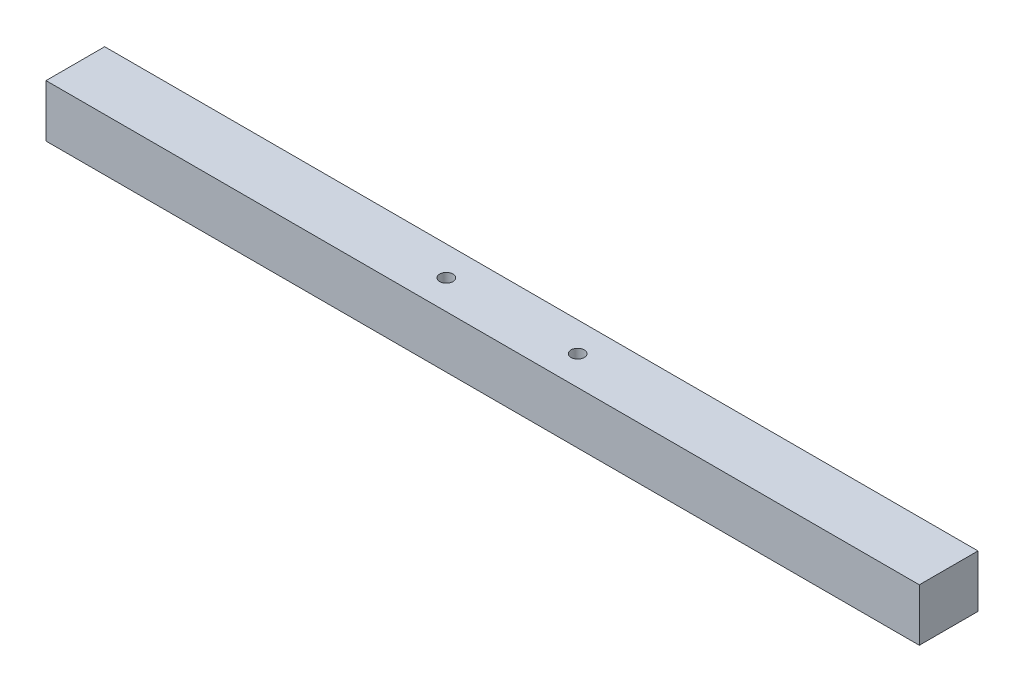
ISO-10303-21;
HEADER;
FILE_DESCRIPTION(('STEP AP214'),'2;1');
FILE_NAME('part.step','',(''),(''),'','','');
FILE_SCHEMA(('AUTOMOTIVE_DESIGN { 1 0 10303 214 1 1 1 1 }'));
ENDSEC;
DATA;
#1=APPLICATION_CONTEXT('core data for automotive mechanical design processes');
#2=APPLICATION_PROTOCOL_DEFINITION('international standard','automotive_design',2000,#1);
#3=PRODUCT_CONTEXT('',#1,'mechanical');
#4=PRODUCT('Part','Part','',(#3));
#5=PRODUCT_RELATED_PRODUCT_CATEGORY('part','',(#4));
#6=PRODUCT_DEFINITION_FORMATION('','',#4);
#7=PRODUCT_DEFINITION_CONTEXT('part definition',#1,'design');
#8=PRODUCT_DEFINITION('design','',#6,#7);
#9=PRODUCT_DEFINITION_SHAPE('','',#8);
#10=(LENGTH_UNIT() NAMED_UNIT(*) SI_UNIT(.MILLI.,.METRE.));
#11=(NAMED_UNIT(*) PLANE_ANGLE_UNIT() SI_UNIT($,.RADIAN.));
#12=(NAMED_UNIT(*) SI_UNIT($,.STERADIAN.) SOLID_ANGLE_UNIT());
#13=UNCERTAINTY_MEASURE_WITH_UNIT(LENGTH_MEASURE(1.E-05),#10,'distance_accuracy_value','');
#14=(GEOMETRIC_REPRESENTATION_CONTEXT(3) GLOBAL_UNCERTAINTY_ASSIGNED_CONTEXT((#13)) GLOBAL_UNIT_ASSIGNED_CONTEXT((#10,
#11,#12)) REPRESENTATION_CONTEXT('',''));
#15=CARTESIAN_POINT('',(0.,0.,0.));
#16=DIRECTION('',(0.,0.,1.));
#17=DIRECTION('',(1.,0.,0.));
#18=AXIS2_PLACEMENT_3D('',#15,#16,#17);
#19=CARTESIAN_POINT('',(0.,15.,0.));
#20=DIRECTION('',(0.,1.,0.));
#21=DIRECTION('',(0.,0.,1.));
#22=AXIS2_PLACEMENT_3D('',#19,#20,#21);
#23=PLANE('',#22);
#24=CARTESIAN_POINT('',(-18.8,15.,0.));
#25=DIRECTION('',(0.,1.,0.));
#26=DIRECTION('',(0.,0.,1.));
#27=AXIS2_PLACEMENT_3D('',#24,#25,#26);
#28=CIRCLE('',#27,1.9);
#29=CARTESIAN_POINT('',(-18.8,15.,1.9));
#30=VERTEX_POINT('',#29);
#31=EDGE_CURVE('E100',#30,#30,#28,.T.);
#32=ORIENTED_EDGE('',*,*,#31,.F.);
#33=EDGE_LOOP('',(#32));
#34=FACE_BOUND('',#33,.T.);
#35=DIRECTION('',(0.,0.,1.));
#36=VECTOR('',#35,1.);
#37=CARTESIAN_POINT('',(-125.,15.,8.40000000000002));
#38=LINE('',#37,#36);
#39=CARTESIAN_POINT('',(-125.,15.,-8.39999999999999));
#40=VERTEX_POINT('',#39);
#41=CARTESIAN_POINT('',(-125.,15.,8.40000000000002));
#42=VERTEX_POINT('',#41);
#43=EDGE_CURVE('E85',#40,#42,#38,.T.);
#44=ORIENTED_EDGE('',*,*,#43,.T.);
#45=DIRECTION('',(1.,0.,0.));
#46=VECTOR('',#45,1.);
#47=CARTESIAN_POINT('',(125.,15.,8.39999999999998));
#48=LINE('',#47,#46);
#49=CARTESIAN_POINT('',(125.,15.,8.39999999999998));
#50=VERTEX_POINT('',#49);
#51=EDGE_CURVE('E80',#42,#50,#48,.T.);
#52=ORIENTED_EDGE('',*,*,#51,.T.);
#53=DIRECTION('',(0.,0.,-1.));
#54=VECTOR('',#53,1.);
#55=CARTESIAN_POINT('',(125.,15.,8.39999999999998));
#56=LINE('',#55,#54);
#57=CARTESIAN_POINT('',(125.,15.,-8.40000000000002));
#58=VERTEX_POINT('',#57);
#59=EDGE_CURVE('E83',#50,#58,#56,.T.);
#60=ORIENTED_EDGE('',*,*,#59,.T.);
#61=DIRECTION('',(-1.,0.,0.));
#62=VECTOR('',#61,1.);
#63=CARTESIAN_POINT('',(125.,15.,-8.40000000000002));
#64=LINE('',#63,#62);
#65=EDGE_CURVE('E50',#58,#40,#64,.T.);
#66=ORIENTED_EDGE('',*,*,#65,.T.);
#67=EDGE_LOOP('',(#44,#52,#60,#66));
#68=FACE_BOUND('',#67,.T.);
#69=CARTESIAN_POINT('',(18.8,15.,0.));
#70=DIRECTION('',(0.,1.,0.));
#71=DIRECTION('',(0.,0.,1.));
#72=AXIS2_PLACEMENT_3D('',#69,#70,#71);
#73=CIRCLE('',#72,1.9);
#74=CARTESIAN_POINT('',(18.8,15.,1.9));
#75=VERTEX_POINT('',#74);
#76=EDGE_CURVE('E115',#75,#75,#73,.T.);
#77=ORIENTED_EDGE('',*,*,#76,.F.);
#78=EDGE_LOOP('',(#77));
#79=FACE_BOUND('',#78,.T.);
#80=ADVANCED_FACE('F33',(#34,#68,#79),#23,.T.);
#81=CARTESIAN_POINT('',(0.,0.,0.));
#82=DIRECTION('',(0.,1.,0.));
#83=DIRECTION('',(0.,0.,1.));
#84=AXIS2_PLACEMENT_3D('',#81,#82,#83);
#85=PLANE('',#84);
#86=CARTESIAN_POINT('',(-18.8,0.,0.));
#87=DIRECTION('',(0.,1.,0.));
#88=DIRECTION('',(0.,0.,1.));
#89=AXIS2_PLACEMENT_3D('',#86,#87,#88);
#90=CIRCLE('',#89,1.9);
#91=CARTESIAN_POINT('',(-18.8,0.,1.9));
#92=VERTEX_POINT('',#91);
#93=EDGE_CURVE('E112',#92,#92,#90,.T.);
#94=ORIENTED_EDGE('',*,*,#93,.T.);
#95=EDGE_LOOP('',(#94));
#96=FACE_BOUND('',#95,.T.);
#97=DIRECTION('',(0.,0.,1.));
#98=VECTOR('',#97,1.);
#99=CARTESIAN_POINT('',(-125.,0.,8.40000000000002));
#100=LINE('',#99,#98);
#101=CARTESIAN_POINT('',(-125.,0.,-8.39999999999999));
#102=VERTEX_POINT('',#101);
#103=CARTESIAN_POINT('',(-125.,0.,8.40000000000002));
#104=VERTEX_POINT('',#103);
#105=EDGE_CURVE('E97',#102,#104,#100,.T.);
#106=ORIENTED_EDGE('',*,*,#105,.F.);
#107=DIRECTION('',(-1.,0.,0.));
#108=VECTOR('',#107,1.);
#109=CARTESIAN_POINT('',(125.,0.,-8.40000000000002));
#110=LINE('',#109,#108);
#111=CARTESIAN_POINT('',(125.,0.,-8.40000000000002));
#112=VERTEX_POINT('',#111);
#113=EDGE_CURVE('E73',#112,#102,#110,.T.);
#114=ORIENTED_EDGE('',*,*,#113,.F.);
#115=DIRECTION('',(0.,0.,-1.));
#116=VECTOR('',#115,1.);
#117=CARTESIAN_POINT('',(125.,0.,8.39999999999998));
#118=LINE('',#117,#116);
#119=CARTESIAN_POINT('',(125.,0.,8.39999999999998));
#120=VERTEX_POINT('',#119);
#121=EDGE_CURVE('E67',#120,#112,#118,.T.);
#122=ORIENTED_EDGE('',*,*,#121,.F.);
#123=DIRECTION('',(1.,0.,0.));
#124=VECTOR('',#123,1.);
#125=CARTESIAN_POINT('',(125.,0.,8.39999999999998));
#126=LINE('',#125,#124);
#127=EDGE_CURVE('E89',#104,#120,#126,.T.);
#128=ORIENTED_EDGE('',*,*,#127,.F.);
#129=EDGE_LOOP('',(#106,#114,#122,#128));
#130=FACE_BOUND('',#129,.T.);
#131=CARTESIAN_POINT('',(18.8,0.,0.));
#132=DIRECTION('',(0.,1.,0.));
#133=DIRECTION('',(0.,0.,1.));
#134=AXIS2_PLACEMENT_3D('',#131,#132,#133);
#135=CIRCLE('',#134,1.9);
#136=CARTESIAN_POINT('',(18.8,0.,1.9));
#137=VERTEX_POINT('',#136);
#138=EDGE_CURVE('E118',#137,#137,#135,.T.);
#139=ORIENTED_EDGE('',*,*,#138,.T.);
#140=EDGE_LOOP('',(#139));
#141=FACE_BOUND('',#140,.T.);
#142=ADVANCED_FACE('F108',(#96,#130,#141),#85,.F.);
#143=CARTESIAN_POINT('',(-125.,15.,8.40000000000002));
#144=DIRECTION('',(1.,0.,0.));
#145=DIRECTION('',(0.,0.,-1.));
#146=AXIS2_PLACEMENT_3D('',#143,#144,#145);
#147=PLANE('',#146);
#148=ORIENTED_EDGE('',*,*,#105,.T.);
#149=DIRECTION('',(0.,-1.,0.));
#150=VECTOR('',#149,1.);
#151=CARTESIAN_POINT('',(-125.,15.,8.40000000000002));
#152=LINE('',#151,#150);
#153=EDGE_CURVE('E11',#42,#104,#152,.T.);
#154=ORIENTED_EDGE('',*,*,#153,.F.);
#155=ORIENTED_EDGE('',*,*,#43,.F.);
#156=DIRECTION('',(0.,-1.,0.));
#157=VECTOR('',#156,1.);
#158=CARTESIAN_POINT('',(-125.,15.,-8.39999999999999));
#159=LINE('',#158,#157);
#160=EDGE_CURVE('E93',#40,#102,#159,.T.);
#161=ORIENTED_EDGE('',*,*,#160,.T.);
#162=EDGE_LOOP('',(#148,#154,#155,#161));
#163=FACE_BOUND('',#162,.T.);
#164=ADVANCED_FACE('F35',(#163),#147,.F.);
#165=CARTESIAN_POINT('',(125.,15.,8.39999999999998));
#166=DIRECTION('',(0.,0.,-1.));
#167=DIRECTION('',(-1.,0.,0.));
#168=AXIS2_PLACEMENT_3D('',#165,#166,#167);
#169=PLANE('',#168);
#170=ORIENTED_EDGE('',*,*,#127,.T.);
#171=DIRECTION('',(0.,-1.,0.));
#172=VECTOR('',#171,1.);
#173=CARTESIAN_POINT('',(125.,15.,8.39999999999998));
#174=LINE('',#173,#172);
#175=EDGE_CURVE('E42',#50,#120,#174,.T.);
#176=ORIENTED_EDGE('',*,*,#175,.F.);
#177=ORIENTED_EDGE('',*,*,#51,.F.);
#178=ORIENTED_EDGE('',*,*,#153,.T.);
#179=EDGE_LOOP('',(#170,#176,#177,#178));
#180=FACE_BOUND('',#179,.T.);
#181=ADVANCED_FACE('F88',(#180),#169,.F.);
#182=CARTESIAN_POINT('',(125.,15.,8.39999999999998));
#183=DIRECTION('',(-1.,0.,0.));
#184=DIRECTION('',(0.,0.,1.));
#185=AXIS2_PLACEMENT_3D('',#182,#183,#184);
#186=PLANE('',#185);
#187=ORIENTED_EDGE('',*,*,#121,.T.);
#188=DIRECTION('',(0.,-1.,0.));
#189=VECTOR('',#188,1.);
#190=CARTESIAN_POINT('',(125.,15.,-8.40000000000002));
#191=LINE('',#190,#189);
#192=EDGE_CURVE('E90',#58,#112,#191,.T.);
#193=ORIENTED_EDGE('',*,*,#192,.F.);
#194=ORIENTED_EDGE('',*,*,#59,.F.);
#195=ORIENTED_EDGE('',*,*,#175,.T.);
#196=EDGE_LOOP('',(#187,#193,#194,#195));
#197=FACE_BOUND('',#196,.T.);
#198=ADVANCED_FACE('F91',(#197),#186,.F.);
#199=CARTESIAN_POINT('',(125.,15.,-8.40000000000002));
#200=DIRECTION('',(0.,0.,1.));
#201=DIRECTION('',(1.,0.,0.));
#202=AXIS2_PLACEMENT_3D('',#199,#200,#201);
#203=PLANE('',#202);
#204=ORIENTED_EDGE('',*,*,#113,.T.);
#205=ORIENTED_EDGE('',*,*,#160,.F.);
#206=ORIENTED_EDGE('',*,*,#65,.F.);
#207=ORIENTED_EDGE('',*,*,#192,.T.);
#208=EDGE_LOOP('',(#204,#205,#206,#207));
#209=FACE_BOUND('',#208,.T.);
#210=ADVANCED_FACE('F105',(#209),#203,.F.);
#211=CARTESIAN_POINT('',(-18.8,15.,0.));
#212=DIRECTION('',(0.,-1.,0.));
#213=DIRECTION('',(0.,0.,-1.));
#214=AXIS2_PLACEMENT_3D('',#211,#212,#213);
#215=CYLINDRICAL_SURFACE('',#214,1.9);
#216=ORIENTED_EDGE('',*,*,#31,.T.);
#217=EDGE_LOOP('',(#216));
#218=FACE_BOUND('',#217,.T.);
#219=ORIENTED_EDGE('',*,*,#93,.F.);
#220=EDGE_LOOP('',(#219));
#221=FACE_BOUND('',#220,.T.);
#222=ADVANCED_FACE('F136',(#218,#221),#215,.F.);
#223=CARTESIAN_POINT('',(18.8,15.,0.));
#224=DIRECTION('',(0.,-1.,0.));
#225=DIRECTION('',(0.,0.,-1.));
#226=AXIS2_PLACEMENT_3D('',#223,#224,#225);
#227=CYLINDRICAL_SURFACE('',#226,1.9);
#228=ORIENTED_EDGE('',*,*,#76,.T.);
#229=EDGE_LOOP('',(#228));
#230=FACE_BOUND('',#229,.T.);
#231=ORIENTED_EDGE('',*,*,#138,.F.);
#232=EDGE_LOOP('',(#231));
#233=FACE_BOUND('',#232,.T.);
#234=ADVANCED_FACE('F124',(#230,#233),#227,.F.);
#235=CLOSED_SHELL('',(#80,#142,#164,#181,#198,#210,#222,#234));
#236=MANIFOLD_SOLID_BREP('B2',#235);
#237=ADVANCED_BREP_SHAPE_REPRESENTATION('',(#18,#236),#14);
#238=SHAPE_DEFINITION_REPRESENTATION(#9,#237);
ENDSEC;
END-ISO-10303-21;
